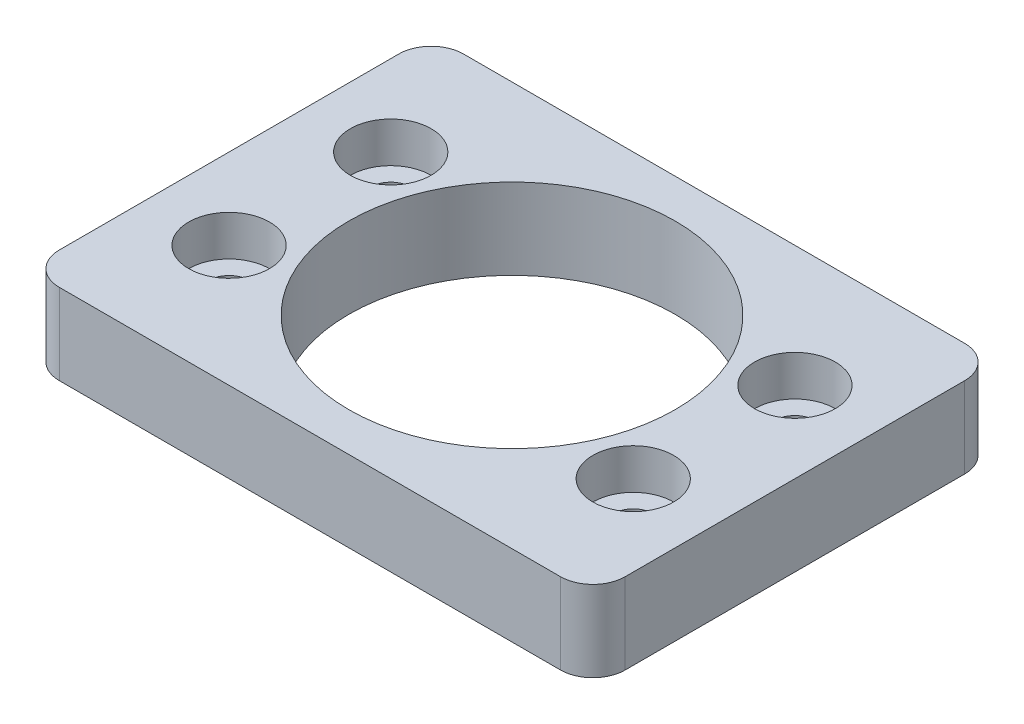
ISO-10303-21;
HEADER;
FILE_DESCRIPTION(('STEP AP214'),'2;1');
FILE_NAME('part.step','',(''),(''),'','','');
FILE_SCHEMA(('AUTOMOTIVE_DESIGN { 1 0 10303 214 1 1 1 1 }'));
ENDSEC;
DATA;
#1=APPLICATION_CONTEXT('core data for automotive mechanical design processes');
#2=APPLICATION_PROTOCOL_DEFINITION('international standard','automotive_design',2000,#1);
#3=PRODUCT_CONTEXT('',#1,'mechanical');
#4=PRODUCT('Part','Part','',(#3));
#5=PRODUCT_RELATED_PRODUCT_CATEGORY('part','',(#4));
#6=PRODUCT_DEFINITION_FORMATION('','',#4);
#7=PRODUCT_DEFINITION_CONTEXT('part definition',#1,'design');
#8=PRODUCT_DEFINITION('design','',#6,#7);
#9=PRODUCT_DEFINITION_SHAPE('','',#8);
#10=(LENGTH_UNIT() NAMED_UNIT(*) SI_UNIT(.MILLI.,.METRE.));
#11=(NAMED_UNIT(*) PLANE_ANGLE_UNIT() SI_UNIT($,.RADIAN.));
#12=(NAMED_UNIT(*) SI_UNIT($,.STERADIAN.) SOLID_ANGLE_UNIT());
#13=UNCERTAINTY_MEASURE_WITH_UNIT(LENGTH_MEASURE(1.E-05),#10,'distance_accuracy_value','');
#14=(GEOMETRIC_REPRESENTATION_CONTEXT(3) GLOBAL_UNCERTAINTY_ASSIGNED_CONTEXT((#13)) GLOBAL_UNIT_ASSIGNED_CONTEXT((#10,
#11,#12)) REPRESENTATION_CONTEXT('',''));
#15=CARTESIAN_POINT('',(0.,0.,0.));
#16=DIRECTION('',(0.,0.,1.));
#17=DIRECTION('',(1.,0.,0.));
#18=AXIS2_PLACEMENT_3D('',#15,#16,#17);
#19=CARTESIAN_POINT('',(-31.75,12.7,-12.7));
#20=DIRECTION('',(0.,-1.,0.));
#21=DIRECTION('',(0.,0.,-1.));
#22=AXIS2_PLACEMENT_3D('',#19,#20,#21);
#23=CYLINDRICAL_SURFACE('',#22,3.175);
#24=CARTESIAN_POINT('',(-31.75,0.,-12.7));
#25=DIRECTION('',(0.,1.,0.));
#26=DIRECTION('',(0.,0.,1.));
#27=AXIS2_PLACEMENT_3D('',#24,#25,#26);
#28=CIRCLE('',#27,3.175);
#29=CARTESIAN_POINT('',(-31.75,0.,-9.52499999999999));
#30=VERTEX_POINT('',#29);
#31=EDGE_CURVE('E186',#30,#30,#28,.T.);
#32=ORIENTED_EDGE('',*,*,#31,.F.);
#33=EDGE_LOOP('',(#32));
#34=FACE_BOUND('',#33,.T.);
#35=CARTESIAN_POINT('',(-31.75,6.35,-12.7));
#36=DIRECTION('',(0.,1.,0.));
#37=DIRECTION('',(0.,0.,1.));
#38=AXIS2_PLACEMENT_3D('',#35,#36,#37);
#39=CIRCLE('',#38,3.175);
#40=CARTESIAN_POINT('',(-31.75,6.35,-9.52499999999999));
#41=VERTEX_POINT('',#40);
#42=EDGE_CURVE('E37',#41,#41,#39,.T.);
#43=ORIENTED_EDGE('',*,*,#42,.T.);
#44=EDGE_LOOP('',(#43));
#45=FACE_BOUND('',#44,.T.);
#46=ADVANCED_FACE('F33',(#34,#45),#23,.F.);
#47=CARTESIAN_POINT('',(-31.75,12.7,12.6999999999999));
#48=DIRECTION('',(0.,-1.,0.));
#49=DIRECTION('',(0.,0.,-1.));
#50=AXIS2_PLACEMENT_3D('',#47,#48,#49);
#51=CYLINDRICAL_SURFACE('',#50,3.175);
#52=CARTESIAN_POINT('',(-31.75,0.,12.7));
#53=DIRECTION('',(0.,1.,0.));
#54=DIRECTION('',(0.,0.,1.));
#55=AXIS2_PLACEMENT_3D('',#52,#53,#54);
#56=CIRCLE('',#55,3.175);
#57=CARTESIAN_POINT('',(-31.75,0.,15.875));
#58=VERTEX_POINT('',#57);
#59=EDGE_CURVE('E178',#58,#58,#56,.T.);
#60=ORIENTED_EDGE('',*,*,#59,.F.);
#61=EDGE_LOOP('',(#60));
#62=FACE_BOUND('',#61,.T.);
#63=CARTESIAN_POINT('',(-31.75,6.35,12.7));
#64=DIRECTION('',(0.,1.,0.));
#65=DIRECTION('',(0.,0.,1.));
#66=AXIS2_PLACEMENT_3D('',#63,#64,#65);
#67=CIRCLE('',#66,3.175);
#68=CARTESIAN_POINT('',(-31.75,6.35,15.875));
#69=VERTEX_POINT('',#68);
#70=EDGE_CURVE('E164',#69,#69,#67,.T.);
#71=ORIENTED_EDGE('',*,*,#70,.T.);
#72=EDGE_LOOP('',(#71));
#73=FACE_BOUND('',#72,.T.);
#74=ADVANCED_FACE('F227',(#62,#73),#51,.F.);
#75=CARTESIAN_POINT('',(31.75,12.7,12.6999999999999));
#76=DIRECTION('',(0.,-1.,0.));
#77=DIRECTION('',(0.,0.,-1.));
#78=AXIS2_PLACEMENT_3D('',#75,#76,#77);
#79=CYLINDRICAL_SURFACE('',#78,3.175);
#80=CARTESIAN_POINT('',(31.75,0.,12.7));
#81=DIRECTION('',(0.,1.,0.));
#82=DIRECTION('',(0.,0.,1.));
#83=AXIS2_PLACEMENT_3D('',#80,#81,#82);
#84=CIRCLE('',#83,3.175);
#85=CARTESIAN_POINT('',(31.75,0.,15.875));
#86=VERTEX_POINT('',#85);
#87=EDGE_CURVE('E173',#86,#86,#84,.T.);
#88=ORIENTED_EDGE('',*,*,#87,.F.);
#89=EDGE_LOOP('',(#88));
#90=FACE_BOUND('',#89,.T.);
#91=CARTESIAN_POINT('',(31.75,6.35,12.7));
#92=DIRECTION('',(0.,1.,0.));
#93=DIRECTION('',(0.,0.,1.));
#94=AXIS2_PLACEMENT_3D('',#91,#92,#93);
#95=CIRCLE('',#94,3.175);
#96=CARTESIAN_POINT('',(31.75,6.35,15.875));
#97=VERTEX_POINT('',#96);
#98=EDGE_CURVE('E161',#97,#97,#95,.T.);
#99=ORIENTED_EDGE('',*,*,#98,.T.);
#100=EDGE_LOOP('',(#99));
#101=FACE_BOUND('',#100,.T.);
#102=ADVANCED_FACE('F233',(#90,#101),#79,.F.);
#103=CARTESIAN_POINT('',(31.75,12.7,-12.7000000000001));
#104=DIRECTION('',(0.,-1.,0.));
#105=DIRECTION('',(0.,0.,-1.));
#106=AXIS2_PLACEMENT_3D('',#103,#104,#105);
#107=CYLINDRICAL_SURFACE('',#106,3.175);
#108=CARTESIAN_POINT('',(31.75,0.,-12.7));
#109=DIRECTION('',(0.,1.,0.));
#110=DIRECTION('',(0.,0.,1.));
#111=AXIS2_PLACEMENT_3D('',#108,#109,#110);
#112=CIRCLE('',#111,3.175);
#113=CARTESIAN_POINT('',(31.75,0.,-9.52500000000001));
#114=VERTEX_POINT('',#113);
#115=EDGE_CURVE('E169',#114,#114,#112,.T.);
#116=ORIENTED_EDGE('',*,*,#115,.F.);
#117=EDGE_LOOP('',(#116));
#118=FACE_BOUND('',#117,.T.);
#119=CARTESIAN_POINT('',(31.75,6.34999999999999,-12.7));
#120=DIRECTION('',(0.,1.,0.));
#121=DIRECTION('',(0.,0.,1.));
#122=AXIS2_PLACEMENT_3D('',#119,#120,#121);
#123=CIRCLE('',#122,3.175);
#124=CARTESIAN_POINT('',(31.75,6.34999999999999,-9.52500000000001));
#125=VERTEX_POINT('',#124);
#126=EDGE_CURVE('E158',#125,#125,#123,.T.);
#127=ORIENTED_EDGE('',*,*,#126,.T.);
#128=EDGE_LOOP('',(#127));
#129=FACE_BOUND('',#128,.T.);
#130=ADVANCED_FACE('F245',(#118,#129),#107,.F.);
#131=CARTESIAN_POINT('',(0.,12.7,0.));
#132=DIRECTION('',(0.,-1.,0.));
#133=DIRECTION('',(0.,0.,-1.));
#134=AXIS2_PLACEMENT_3D('',#131,#132,#133);
#135=PLANE('',#134);
#136=CARTESIAN_POINT('',(31.75,12.7,-12.7000000000001));
#137=DIRECTION('',(0.,1.,0.));
#138=DIRECTION('',(0.,0.,1.));
#139=AXIS2_PLACEMENT_3D('',#136,#137,#138);
#140=CIRCLE('',#139,6.35);
#141=CARTESIAN_POINT('',(31.75,12.7,-6.35000000000006));
#142=VERTEX_POINT('',#141);
#143=EDGE_CURVE('E371',#142,#142,#140,.T.);
#144=ORIENTED_EDGE('',*,*,#143,.F.);
#145=EDGE_LOOP('',(#144));
#146=FACE_BOUND('',#145,.T.);
#147=CARTESIAN_POINT('',(31.75,12.7,12.6999999999999));
#148=DIRECTION('',(0.,1.,0.));
#149=DIRECTION('',(0.,0.,1.));
#150=AXIS2_PLACEMENT_3D('',#147,#148,#149);
#151=CIRCLE('',#150,6.35);
#152=CARTESIAN_POINT('',(31.75,12.7,19.0499999999999));
#153=VERTEX_POINT('',#152);
#154=EDGE_CURVE('E377',#153,#153,#151,.T.);
#155=ORIENTED_EDGE('',*,*,#154,.F.);
#156=EDGE_LOOP('',(#155));
#157=FACE_BOUND('',#156,.T.);
#158=CARTESIAN_POINT('',(-31.75,12.7,12.6999999999999));
#159=DIRECTION('',(0.,1.,0.));
#160=DIRECTION('',(0.,0.,1.));
#161=AXIS2_PLACEMENT_3D('',#158,#159,#160);
#162=CIRCLE('',#161,6.35);
#163=CARTESIAN_POINT('',(-31.75,12.7,19.0499999999999));
#164=VERTEX_POINT('',#163);
#165=EDGE_CURVE('E383',#164,#164,#162,.T.);
#166=ORIENTED_EDGE('',*,*,#165,.F.);
#167=EDGE_LOOP('',(#166));
#168=FACE_BOUND('',#167,.T.);
#169=CARTESIAN_POINT('',(-31.75,12.7,-12.7));
#170=DIRECTION('',(0.,1.,0.));
#171=DIRECTION('',(0.,0.,1.));
#172=AXIS2_PLACEMENT_3D('',#169,#170,#171);
#173=CIRCLE('',#172,6.35);
#174=CARTESIAN_POINT('',(-31.75,12.7,-6.35000000000004));
#175=VERTEX_POINT('',#174);
#176=EDGE_CURVE('E181',#175,#175,#173,.T.);
#177=ORIENTED_EDGE('',*,*,#176,.F.);
#178=EDGE_LOOP('',(#177));
#179=FACE_BOUND('',#178,.T.);
#180=DIRECTION('',(-1.,0.,0.));
#181=VECTOR('',#180,1.);
#182=CARTESIAN_POINT('',(-44.45,12.7,-31.75));
#183=LINE('',#182,#181);
#184=CARTESIAN_POINT('',(39.37,12.7,-31.75));
#185=VERTEX_POINT('',#184);
#186=CARTESIAN_POINT('',(-39.37,12.7,-31.75));
#187=VERTEX_POINT('',#186);
#188=EDGE_CURVE('E197',#185,#187,#183,.T.);
#189=ORIENTED_EDGE('',*,*,#188,.T.);
#190=CARTESIAN_POINT('',(-39.37,12.7,-26.67));
#191=DIRECTION('',(0.,-1.,0.));
#192=DIRECTION('',(0.,0.,-1.));
#193=AXIS2_PLACEMENT_3D('',#190,#191,#192);
#194=CIRCLE('',#193,5.08);
#195=CARTESIAN_POINT('',(-44.45,12.7,-26.67));
#196=VERTEX_POINT('',#195);
#197=EDGE_CURVE('E149',#187,#196,#194,.F.);
#198=ORIENTED_EDGE('',*,*,#197,.T.);
#199=DIRECTION('',(0.,0.,1.));
#200=VECTOR('',#199,1.);
#201=CARTESIAN_POINT('',(-44.45,12.7,31.7499999999999));
#202=LINE('',#201,#200);
#203=CARTESIAN_POINT('',(-44.45,12.7,26.6699999999999));
#204=VERTEX_POINT('',#203);
#205=EDGE_CURVE('E119',#196,#204,#202,.T.);
#206=ORIENTED_EDGE('',*,*,#205,.T.);
#207=CARTESIAN_POINT('',(-39.37,12.7,26.6699999999999));
#208=DIRECTION('',(0.,-1.,0.));
#209=DIRECTION('',(0.,0.,-1.));
#210=AXIS2_PLACEMENT_3D('',#207,#208,#209);
#211=CIRCLE('',#210,5.08);
#212=CARTESIAN_POINT('',(-39.37,12.7,31.7499999999999));
#213=VERTEX_POINT('',#212);
#214=EDGE_CURVE('E55',#204,#213,#211,.F.);
#215=ORIENTED_EDGE('',*,*,#214,.T.);
#216=DIRECTION('',(1.,0.,0.));
#217=VECTOR('',#216,1.);
#218=CARTESIAN_POINT('',(-44.45,12.7,31.7499999999999));
#219=LINE('',#218,#217);
#220=CARTESIAN_POINT('',(39.37,12.7,31.7499999999999));
#221=VERTEX_POINT('',#220);
#222=EDGE_CURVE('E135',#213,#221,#219,.T.);
#223=ORIENTED_EDGE('',*,*,#222,.T.);
#224=CARTESIAN_POINT('',(39.37,12.7,26.6699999999999));
#225=DIRECTION('',(0.,-1.,0.));
#226=DIRECTION('',(0.,0.,-1.));
#227=AXIS2_PLACEMENT_3D('',#224,#225,#226);
#228=CIRCLE('',#227,5.08);
#229=CARTESIAN_POINT('',(44.45,12.7,26.6699999999999));
#230=VERTEX_POINT('',#229);
#231=EDGE_CURVE('E145',#221,#230,#228,.F.);
#232=ORIENTED_EDGE('',*,*,#231,.T.);
#233=DIRECTION('',(0.,0.,-1.));
#234=VECTOR('',#233,1.);
#235=CARTESIAN_POINT('',(44.45,12.7,31.7499999999999));
#236=LINE('',#235,#234);
#237=CARTESIAN_POINT('',(44.45,12.7,-26.67));
#238=VERTEX_POINT('',#237);
#239=EDGE_CURVE('E129',#230,#238,#236,.T.);
#240=ORIENTED_EDGE('',*,*,#239,.T.);
#241=CARTESIAN_POINT('',(39.37,12.7,-26.67));
#242=DIRECTION('',(0.,-1.,0.));
#243=DIRECTION('',(0.,0.,-1.));
#244=AXIS2_PLACEMENT_3D('',#241,#242,#243);
#245=CIRCLE('',#244,5.08);
#246=EDGE_CURVE('E147',#238,#185,#245,.F.);
#247=ORIENTED_EDGE('',*,*,#246,.T.);
#248=EDGE_LOOP('',(#189,#198,#206,#215,#223,#232,#240,#247));
#249=FACE_BOUND('',#248,.T.);
#250=CARTESIAN_POINT('',(0.,12.7,0.));
#251=DIRECTION('',(0.,1.,0.));
#252=DIRECTION('',(0.,0.,1.));
#253=AXIS2_PLACEMENT_3D('',#250,#251,#252);
#254=CIRCLE('',#253,25.654);
#255=CARTESIAN_POINT('',(0.,12.7,25.6539999999999));
#256=VERTEX_POINT('',#255);
#257=EDGE_CURVE('E190',#256,#256,#254,.T.);
#258=ORIENTED_EDGE('',*,*,#257,.F.);
#259=EDGE_LOOP('',(#258));
#260=FACE_BOUND('',#259,.T.);
#261=ADVANCED_FACE('F213',(#146,#157,#168,#179,#249,#260),#135,.F.);
#262=CARTESIAN_POINT('',(0.,0.,0.));
#263=DIRECTION('',(0.,-1.,0.));
#264=DIRECTION('',(0.,0.,-1.));
#265=AXIS2_PLACEMENT_3D('',#262,#263,#264);
#266=PLANE('',#265);
#267=ORIENTED_EDGE('',*,*,#87,.T.);
#268=EDGE_LOOP('',(#267));
#269=FACE_BOUND('',#268,.T.);
#270=ORIENTED_EDGE('',*,*,#31,.T.);
#271=EDGE_LOOP('',(#270));
#272=FACE_BOUND('',#271,.T.);
#273=DIRECTION('',(0.,0.,1.));
#274=VECTOR('',#273,1.);
#275=CARTESIAN_POINT('',(-44.45,0.,31.75));
#276=LINE('',#275,#274);
#277=CARTESIAN_POINT('',(-44.45,0.,-26.67));
#278=VERTEX_POINT('',#277);
#279=CARTESIAN_POINT('',(-44.45,0.,26.67));
#280=VERTEX_POINT('',#279);
#281=EDGE_CURVE('E117',#278,#280,#276,.T.);
#282=ORIENTED_EDGE('',*,*,#281,.F.);
#283=CARTESIAN_POINT('',(-39.37,0.,-26.67));
#284=DIRECTION('',(0.,-1.,0.));
#285=DIRECTION('',(0.,0.,-1.));
#286=AXIS2_PLACEMENT_3D('',#283,#284,#285);
#287=CIRCLE('',#286,5.08);
#288=CARTESIAN_POINT('',(-39.37,0.,-31.75));
#289=VERTEX_POINT('',#288);
#290=EDGE_CURVE('E100',#278,#289,#287,.T.);
#291=ORIENTED_EDGE('',*,*,#290,.T.);
#292=DIRECTION('',(-1.,0.,0.));
#293=VECTOR('',#292,1.);
#294=CARTESIAN_POINT('',(-44.45,0.,-31.75));
#295=LINE('',#294,#293);
#296=CARTESIAN_POINT('',(39.37,0.,-31.75));
#297=VERTEX_POINT('',#296);
#298=EDGE_CURVE('E127',#297,#289,#295,.T.);
#299=ORIENTED_EDGE('',*,*,#298,.F.);
#300=CARTESIAN_POINT('',(39.37,0.,-26.67));
#301=DIRECTION('',(0.,-1.,0.));
#302=DIRECTION('',(0.,0.,-1.));
#303=AXIS2_PLACEMENT_3D('',#300,#301,#302);
#304=CIRCLE('',#303,5.08);
#305=CARTESIAN_POINT('',(44.45,0.,-26.67));
#306=VERTEX_POINT('',#305);
#307=EDGE_CURVE('E111',#297,#306,#304,.T.);
#308=ORIENTED_EDGE('',*,*,#307,.T.);
#309=DIRECTION('',(0.,0.,-1.));
#310=VECTOR('',#309,1.);
#311=CARTESIAN_POINT('',(44.45,0.,31.75));
#312=LINE('',#311,#310);
#313=CARTESIAN_POINT('',(44.45,0.,26.67));
#314=VERTEX_POINT('',#313);
#315=EDGE_CURVE('E131',#314,#306,#312,.T.);
#316=ORIENTED_EDGE('',*,*,#315,.F.);
#317=CARTESIAN_POINT('',(39.37,0.,26.67));
#318=DIRECTION('',(0.,-1.,0.));
#319=DIRECTION('',(0.,0.,-1.));
#320=AXIS2_PLACEMENT_3D('',#317,#318,#319);
#321=CIRCLE('',#320,5.08);
#322=CARTESIAN_POINT('',(39.37,0.,31.75));
#323=VERTEX_POINT('',#322);
#324=EDGE_CURVE('E138',#314,#323,#321,.T.);
#325=ORIENTED_EDGE('',*,*,#324,.T.);
#326=DIRECTION('',(1.,0.,0.));
#327=VECTOR('',#326,1.);
#328=CARTESIAN_POINT('',(-44.45,0.,31.75));
#329=LINE('',#328,#327);
#330=CARTESIAN_POINT('',(-39.37,0.,31.75));
#331=VERTEX_POINT('',#330);
#332=EDGE_CURVE('E126',#331,#323,#329,.T.);
#333=ORIENTED_EDGE('',*,*,#332,.F.);
#334=CARTESIAN_POINT('',(-39.37,0.,26.67));
#335=DIRECTION('',(0.,-1.,0.));
#336=DIRECTION('',(0.,0.,-1.));
#337=AXIS2_PLACEMENT_3D('',#334,#335,#336);
#338=CIRCLE('',#337,5.08);
#339=EDGE_CURVE('E120',#331,#280,#338,.T.);
#340=ORIENTED_EDGE('',*,*,#339,.T.);
#341=EDGE_LOOP('',(#282,#291,#299,#308,#316,#325,#333,#340));
#342=FACE_BOUND('',#341,.T.);
#343=CARTESIAN_POINT('',(0.,0.,0.));
#344=DIRECTION('',(0.,1.,0.));
#345=DIRECTION('',(0.,0.,1.));
#346=AXIS2_PLACEMENT_3D('',#343,#344,#345);
#347=CIRCLE('',#346,25.654);
#348=CARTESIAN_POINT('',(0.,0.,25.654));
#349=VERTEX_POINT('',#348);
#350=EDGE_CURVE('E189',#349,#349,#347,.T.);
#351=ORIENTED_EDGE('',*,*,#350,.T.);
#352=EDGE_LOOP('',(#351));
#353=FACE_BOUND('',#352,.T.);
#354=ORIENTED_EDGE('',*,*,#59,.T.);
#355=EDGE_LOOP('',(#354));
#356=FACE_BOUND('',#355,.T.);
#357=ORIENTED_EDGE('',*,*,#115,.T.);
#358=EDGE_LOOP('',(#357));
#359=FACE_BOUND('',#358,.T.);
#360=ADVANCED_FACE('F123',(#269,#272,#342,#353,#356,#359),#266,.T.);
#361=CARTESIAN_POINT('',(44.45,12.7,31.7499999999999));
#362=DIRECTION('',(-1.,0.,0.));
#363=DIRECTION('',(0.,0.,1.));
#364=AXIS2_PLACEMENT_3D('',#361,#362,#363);
#365=PLANE('',#364);
#366=ORIENTED_EDGE('',*,*,#315,.T.);
#367=DIRECTION('',(0.,-1.,0.));
#368=VECTOR('',#367,1.);
#369=CARTESIAN_POINT('',(44.45,12.7,-26.67));
#370=LINE('',#369,#368);
#371=EDGE_CURVE('E154',#306,#238,#370,.F.);
#372=ORIENTED_EDGE('',*,*,#371,.T.);
#373=ORIENTED_EDGE('',*,*,#239,.F.);
#374=DIRECTION('',(0.,-1.,0.));
#375=VECTOR('',#374,1.);
#376=CARTESIAN_POINT('',(44.45,12.7,26.6699999999999));
#377=LINE('',#376,#375);
#378=EDGE_CURVE('E151',#230,#314,#377,.T.);
#379=ORIENTED_EDGE('',*,*,#378,.T.);
#380=EDGE_LOOP('',(#366,#372,#373,#379));
#381=FACE_BOUND('',#380,.T.);
#382=ADVANCED_FACE('F205',(#381),#365,.F.);
#383=CARTESIAN_POINT('',(-44.45,12.7,-31.75));
#384=DIRECTION('',(0.,0.,1.));
#385=DIRECTION('',(1.,0.,0.));
#386=AXIS2_PLACEMENT_3D('',#383,#384,#385);
#387=PLANE('',#386);
#388=ORIENTED_EDGE('',*,*,#298,.T.);
#389=DIRECTION('',(0.,-1.,0.));
#390=VECTOR('',#389,1.);
#391=CARTESIAN_POINT('',(-39.37,12.7,-31.75));
#392=LINE('',#391,#390);
#393=EDGE_CURVE('E105',#289,#187,#392,.F.);
#394=ORIENTED_EDGE('',*,*,#393,.T.);
#395=ORIENTED_EDGE('',*,*,#188,.F.);
#396=DIRECTION('',(0.,-1.,0.));
#397=VECTOR('',#396,1.);
#398=CARTESIAN_POINT('',(39.37,12.7,-31.75));
#399=LINE('',#398,#397);
#400=EDGE_CURVE('E110',#185,#297,#399,.T.);
#401=ORIENTED_EDGE('',*,*,#400,.T.);
#402=EDGE_LOOP('',(#388,#394,#395,#401));
#403=FACE_BOUND('',#402,.T.);
#404=ADVANCED_FACE('F216',(#403),#387,.F.);
#405=CARTESIAN_POINT('',(-44.45,12.7,31.7499999999999));
#406=DIRECTION('',(1.,0.,0.));
#407=DIRECTION('',(0.,0.,-1.));
#408=AXIS2_PLACEMENT_3D('',#405,#406,#407);
#409=PLANE('',#408);
#410=ORIENTED_EDGE('',*,*,#205,.F.);
#411=DIRECTION('',(0.,-1.,0.));
#412=VECTOR('',#411,1.);
#413=CARTESIAN_POINT('',(-44.45,12.7,-26.67));
#414=LINE('',#413,#412);
#415=EDGE_CURVE('E104',#196,#278,#414,.T.);
#416=ORIENTED_EDGE('',*,*,#415,.T.);
#417=ORIENTED_EDGE('',*,*,#281,.T.);
#418=DIRECTION('',(0.,-1.,0.));
#419=VECTOR('',#418,1.);
#420=CARTESIAN_POINT('',(-44.45,12.7,26.6699999999999));
#421=LINE('',#420,#419);
#422=EDGE_CURVE('E121',#280,#204,#421,.F.);
#423=ORIENTED_EDGE('',*,*,#422,.T.);
#424=EDGE_LOOP('',(#410,#416,#417,#423));
#425=FACE_BOUND('',#424,.T.);
#426=ADVANCED_FACE('F116',(#425),#409,.F.);
#427=CARTESIAN_POINT('',(-44.45,12.7,31.7499999999999));
#428=DIRECTION('',(0.,0.,-1.));
#429=DIRECTION('',(-1.,0.,0.));
#430=AXIS2_PLACEMENT_3D('',#427,#428,#429);
#431=PLANE('',#430);
#432=ORIENTED_EDGE('',*,*,#332,.T.);
#433=DIRECTION('',(0.,-1.,0.));
#434=VECTOR('',#433,1.);
#435=CARTESIAN_POINT('',(39.37,12.7,31.7499999999999));
#436=LINE('',#435,#434);
#437=EDGE_CURVE('E11',#323,#221,#436,.F.);
#438=ORIENTED_EDGE('',*,*,#437,.T.);
#439=ORIENTED_EDGE('',*,*,#222,.F.);
#440=DIRECTION('',(0.,-1.,0.));
#441=VECTOR('',#440,1.);
#442=CARTESIAN_POINT('',(-39.37,12.7,31.7499999999999));
#443=LINE('',#442,#441);
#444=EDGE_CURVE('E42',#213,#331,#443,.T.);
#445=ORIENTED_EDGE('',*,*,#444,.T.);
#446=EDGE_LOOP('',(#432,#438,#439,#445));
#447=FACE_BOUND('',#446,.T.);
#448=ADVANCED_FACE('F223',(#447),#431,.F.);
#449=CARTESIAN_POINT('',(0.,12.7,0.));
#450=DIRECTION('',(0.,-1.,0.));
#451=DIRECTION('',(0.,0.,-1.));
#452=AXIS2_PLACEMENT_3D('',#449,#450,#451);
#453=CYLINDRICAL_SURFACE('',#452,25.654);
#454=ORIENTED_EDGE('',*,*,#257,.T.);
#455=EDGE_LOOP('',(#454));
#456=FACE_BOUND('',#455,.T.);
#457=ORIENTED_EDGE('',*,*,#350,.F.);
#458=EDGE_LOOP('',(#457));
#459=FACE_BOUND('',#458,.T.);
#460=ADVANCED_FACE('F239',(#456,#459),#453,.F.);
#461=CARTESIAN_POINT('',(-39.37,12.7,-26.67));
#462=DIRECTION('',(0.,-1.,0.));
#463=DIRECTION('',(0.,0.,-1.));
#464=AXIS2_PLACEMENT_3D('',#461,#462,#463);
#465=CYLINDRICAL_SURFACE('',#464,5.08);
#466=ORIENTED_EDGE('',*,*,#197,.F.);
#467=ORIENTED_EDGE('',*,*,#393,.F.);
#468=ORIENTED_EDGE('',*,*,#290,.F.);
#469=ORIENTED_EDGE('',*,*,#415,.F.);
#470=EDGE_LOOP('',(#466,#467,#468,#469));
#471=FACE_BOUND('',#470,.T.);
#472=ADVANCED_FACE('F103',(#471),#465,.T.);
#473=CARTESIAN_POINT('',(39.37,12.7,-26.67));
#474=DIRECTION('',(0.,-1.,0.));
#475=DIRECTION('',(0.,0.,-1.));
#476=AXIS2_PLACEMENT_3D('',#473,#474,#475);
#477=CYLINDRICAL_SURFACE('',#476,5.08);
#478=ORIENTED_EDGE('',*,*,#246,.F.);
#479=ORIENTED_EDGE('',*,*,#371,.F.);
#480=ORIENTED_EDGE('',*,*,#307,.F.);
#481=ORIENTED_EDGE('',*,*,#400,.F.);
#482=EDGE_LOOP('',(#478,#479,#480,#481));
#483=FACE_BOUND('',#482,.T.);
#484=ADVANCED_FACE('F210',(#483),#477,.T.);
#485=CARTESIAN_POINT('',(39.37,12.7,26.6699999999999));
#486=DIRECTION('',(0.,-1.,0.));
#487=DIRECTION('',(0.,0.,-1.));
#488=AXIS2_PLACEMENT_3D('',#485,#486,#487);
#489=CYLINDRICAL_SURFACE('',#488,5.08);
#490=ORIENTED_EDGE('',*,*,#231,.F.);
#491=ORIENTED_EDGE('',*,*,#437,.F.);
#492=ORIENTED_EDGE('',*,*,#324,.F.);
#493=ORIENTED_EDGE('',*,*,#378,.F.);
#494=EDGE_LOOP('',(#490,#491,#492,#493));
#495=FACE_BOUND('',#494,.T.);
#496=ADVANCED_FACE('F256',(#495),#489,.T.);
#497=CARTESIAN_POINT('',(-39.37,12.7,26.6699999999999));
#498=DIRECTION('',(0.,-1.,0.));
#499=DIRECTION('',(0.,0.,-1.));
#500=AXIS2_PLACEMENT_3D('',#497,#498,#499);
#501=CYLINDRICAL_SURFACE('',#500,5.08);
#502=ORIENTED_EDGE('',*,*,#214,.F.);
#503=ORIENTED_EDGE('',*,*,#422,.F.);
#504=ORIENTED_EDGE('',*,*,#339,.F.);
#505=ORIENTED_EDGE('',*,*,#444,.F.);
#506=EDGE_LOOP('',(#502,#503,#504,#505));
#507=FACE_BOUND('',#506,.T.);
#508=ADVANCED_FACE('F35',(#507),#501,.T.);
#509=CARTESIAN_POINT('',(31.75,6.34999999999999,-12.7));
#510=DIRECTION('',(0.,1.,0.));
#511=DIRECTION('',(0.,0.,1.));
#512=AXIS2_PLACEMENT_3D('',#509,#510,#511);
#513=CYLINDRICAL_SURFACE('',#512,6.35);
#514=CARTESIAN_POINT('',(31.75,6.34999999999999,-12.7));
#515=DIRECTION('',(0.,1.,0.));
#516=DIRECTION('',(0.,0.,1.));
#517=AXIS2_PLACEMENT_3D('',#514,#515,#516);
#518=CIRCLE('',#517,6.35);
#519=CARTESIAN_POINT('',(31.75,6.34999999999999,-6.35));
#520=VERTEX_POINT('',#519);
#521=EDGE_CURVE('E374',#520,#520,#518,.T.);
#522=ORIENTED_EDGE('',*,*,#521,.F.);
#523=EDGE_LOOP('',(#522));
#524=FACE_BOUND('',#523,.T.);
#525=ORIENTED_EDGE('',*,*,#143,.T.);
#526=EDGE_LOOP('',(#525));
#527=FACE_BOUND('',#526,.T.);
#528=ADVANCED_FACE('F259',(#524,#527),#513,.F.);
#529=CARTESIAN_POINT('',(31.75,6.34999999999999,-12.7));
#530=DIRECTION('',(0.,1.,0.));
#531=DIRECTION('',(0.,0.,1.));
#532=AXIS2_PLACEMENT_3D('',#529,#530,#531);
#533=PLANE('',#532);
#534=ORIENTED_EDGE('',*,*,#126,.F.);
#535=EDGE_LOOP('',(#534));
#536=FACE_BOUND('',#535,.T.);
#537=ORIENTED_EDGE('',*,*,#521,.T.);
#538=EDGE_LOOP('',(#537));
#539=FACE_BOUND('',#538,.T.);
#540=ADVANCED_FACE('F264',(#536,#539),#533,.T.);
#541=CARTESIAN_POINT('',(31.75,6.35,12.7));
#542=DIRECTION('',(0.,1.,0.));
#543=DIRECTION('',(0.,0.,1.));
#544=AXIS2_PLACEMENT_3D('',#541,#542,#543);
#545=CYLINDRICAL_SURFACE('',#544,6.35);
#546=CARTESIAN_POINT('',(31.75,6.35,12.7));
#547=DIRECTION('',(0.,1.,0.));
#548=DIRECTION('',(0.,0.,1.));
#549=AXIS2_PLACEMENT_3D('',#546,#547,#548);
#550=CIRCLE('',#549,6.35);
#551=CARTESIAN_POINT('',(31.75,6.35,19.05));
#552=VERTEX_POINT('',#551);
#553=EDGE_CURVE('E380',#552,#552,#550,.T.);
#554=ORIENTED_EDGE('',*,*,#553,.F.);
#555=EDGE_LOOP('',(#554));
#556=FACE_BOUND('',#555,.T.);
#557=ORIENTED_EDGE('',*,*,#154,.T.);
#558=EDGE_LOOP('',(#557));
#559=FACE_BOUND('',#558,.T.);
#560=ADVANCED_FACE('F315',(#556,#559),#545,.F.);
#561=CARTESIAN_POINT('',(31.75,6.35,12.7));
#562=DIRECTION('',(0.,1.,0.));
#563=DIRECTION('',(0.,0.,1.));
#564=AXIS2_PLACEMENT_3D('',#561,#562,#563);
#565=PLANE('',#564);
#566=ORIENTED_EDGE('',*,*,#98,.F.);
#567=EDGE_LOOP('',(#566));
#568=FACE_BOUND('',#567,.T.);
#569=ORIENTED_EDGE('',*,*,#553,.T.);
#570=EDGE_LOOP('',(#569));
#571=FACE_BOUND('',#570,.T.);
#572=ADVANCED_FACE('F323',(#568,#571),#565,.T.);
#573=CARTESIAN_POINT('',(-31.75,6.35,12.7));
#574=DIRECTION('',(0.,1.,0.));
#575=DIRECTION('',(0.,0.,1.));
#576=AXIS2_PLACEMENT_3D('',#573,#574,#575);
#577=CYLINDRICAL_SURFACE('',#576,6.35);
#578=CARTESIAN_POINT('',(-31.75,6.35,12.7));
#579=DIRECTION('',(0.,1.,0.));
#580=DIRECTION('',(0.,0.,1.));
#581=AXIS2_PLACEMENT_3D('',#578,#579,#580);
#582=CIRCLE('',#581,6.35);
#583=CARTESIAN_POINT('',(-31.75,6.35,19.05));
#584=VERTEX_POINT('',#583);
#585=EDGE_CURVE('E369',#584,#584,#582,.T.);
#586=ORIENTED_EDGE('',*,*,#585,.F.);
#587=EDGE_LOOP('',(#586));
#588=FACE_BOUND('',#587,.T.);
#589=ORIENTED_EDGE('',*,*,#165,.T.);
#590=EDGE_LOOP('',(#589));
#591=FACE_BOUND('',#590,.T.);
#592=ADVANCED_FACE('F331',(#588,#591),#577,.F.);
#593=CARTESIAN_POINT('',(-31.75,6.35,12.7));
#594=DIRECTION('',(0.,1.,0.));
#595=DIRECTION('',(0.,0.,1.));
#596=AXIS2_PLACEMENT_3D('',#593,#594,#595);
#597=PLANE('',#596);
#598=ORIENTED_EDGE('',*,*,#70,.F.);
#599=EDGE_LOOP('',(#598));
#600=FACE_BOUND('',#599,.T.);
#601=ORIENTED_EDGE('',*,*,#585,.T.);
#602=EDGE_LOOP('',(#601));
#603=FACE_BOUND('',#602,.T.);
#604=ADVANCED_FACE('F339',(#600,#603),#597,.T.);
#605=CARTESIAN_POINT('',(-31.75,6.35,-12.7));
#606=DIRECTION('',(0.,1.,0.));
#607=DIRECTION('',(0.,0.,1.));
#608=AXIS2_PLACEMENT_3D('',#605,#606,#607);
#609=CYLINDRICAL_SURFACE('',#608,6.35);
#610=CARTESIAN_POINT('',(-31.75,6.35,-12.7));
#611=DIRECTION('',(0.,1.,0.));
#612=DIRECTION('',(0.,0.,1.));
#613=AXIS2_PLACEMENT_3D('',#610,#611,#612);
#614=CIRCLE('',#613,6.35);
#615=CARTESIAN_POINT('',(-31.75,6.35,-6.34999999999999));
#616=VERTEX_POINT('',#615);
#617=EDGE_CURVE('E162',#616,#616,#614,.T.);
#618=ORIENTED_EDGE('',*,*,#617,.F.);
#619=EDGE_LOOP('',(#618));
#620=FACE_BOUND('',#619,.T.);
#621=ORIENTED_EDGE('',*,*,#176,.T.);
#622=EDGE_LOOP('',(#621));
#623=FACE_BOUND('',#622,.T.);
#624=ADVANCED_FACE('F347',(#620,#623),#609,.F.);
#625=CARTESIAN_POINT('',(-31.75,6.35,-12.7));
#626=DIRECTION('',(0.,1.,0.));
#627=DIRECTION('',(0.,0.,1.));
#628=AXIS2_PLACEMENT_3D('',#625,#626,#627);
#629=PLANE('',#628);
#630=ORIENTED_EDGE('',*,*,#42,.F.);
#631=EDGE_LOOP('',(#630));
#632=FACE_BOUND('',#631,.T.);
#633=ORIENTED_EDGE('',*,*,#617,.T.);
#634=EDGE_LOOP('',(#633));
#635=FACE_BOUND('',#634,.T.);
#636=ADVANCED_FACE('F355',(#632,#635),#629,.T.);
#637=CLOSED_SHELL('',(#46,#74,#102,#130,#261,#360,#382,#404,#426,#448,#460,#472,#484,#496,#508,
#528,#540,#560,#572,#592,#604,#624,#636));
#638=MANIFOLD_SOLID_BREP('B2',#637);
#639=ADVANCED_BREP_SHAPE_REPRESENTATION('',(#18,#638),#14);
#640=SHAPE_DEFINITION_REPRESENTATION(#9,#639);
ENDSEC;
END-ISO-10303-21;
